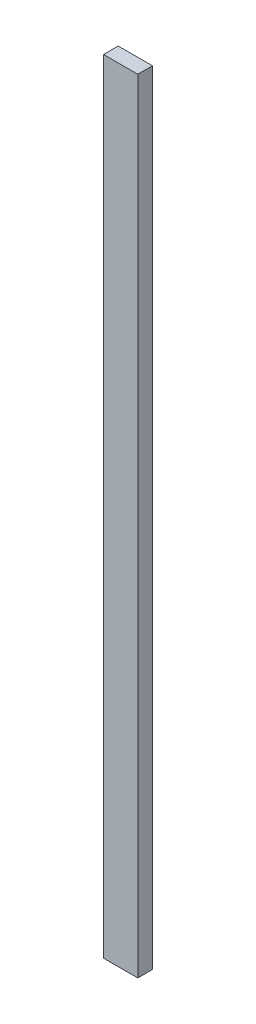
ISO-10303-21;
HEADER;
FILE_DESCRIPTION(('STEP AP214'),'2;1');
FILE_NAME('part.step','',(''),(''),'','','');
FILE_SCHEMA(('AUTOMOTIVE_DESIGN { 1 0 10303 214 1 1 1 1 }'));
ENDSEC;
DATA;
#1=APPLICATION_CONTEXT('core data for automotive mechanical design processes');
#2=APPLICATION_PROTOCOL_DEFINITION('international standard','automotive_design',2000,#1);
#3=PRODUCT_CONTEXT('',#1,'mechanical');
#4=PRODUCT('Part','Part','',(#3));
#5=PRODUCT_RELATED_PRODUCT_CATEGORY('part','',(#4));
#6=PRODUCT_DEFINITION_FORMATION('','',#4);
#7=PRODUCT_DEFINITION_CONTEXT('part definition',#1,'design');
#8=PRODUCT_DEFINITION('design','',#6,#7);
#9=PRODUCT_DEFINITION_SHAPE('','',#8);
#10=(LENGTH_UNIT() NAMED_UNIT(*) SI_UNIT(.MILLI.,.METRE.));
#11=(NAMED_UNIT(*) PLANE_ANGLE_UNIT() SI_UNIT($,.RADIAN.));
#12=(NAMED_UNIT(*) SI_UNIT($,.STERADIAN.) SOLID_ANGLE_UNIT());
#13=UNCERTAINTY_MEASURE_WITH_UNIT(LENGTH_MEASURE(1.E-05),#10,'distance_accuracy_value','');
#14=(GEOMETRIC_REPRESENTATION_CONTEXT(3) GLOBAL_UNCERTAINTY_ASSIGNED_CONTEXT((#13)) GLOBAL_UNIT_ASSIGNED_CONTEXT((#10,
#11,#12)) REPRESENTATION_CONTEXT('',''));
#15=CARTESIAN_POINT('',(0.,0.,0.));
#16=DIRECTION('',(0.,0.,1.));
#17=DIRECTION('',(1.,0.,0.));
#18=AXIS2_PLACEMENT_3D('',#15,#16,#17);
#19=CARTESIAN_POINT('',(44.45,2032.,19.05));
#20=DIRECTION('',(-1.,0.,0.));
#21=DIRECTION('',(0.,0.,1.));
#22=AXIS2_PLACEMENT_3D('',#19,#20,#21);
#23=PLANE('',#22);
#24=DIRECTION('',(0.,0.,-1.));
#25=VECTOR('',#24,1.);
#26=CARTESIAN_POINT('',(44.45,0.,19.05));
#27=LINE('',#26,#25);
#28=CARTESIAN_POINT('',(44.45,0.,19.05));
#29=VERTEX_POINT('',#28);
#30=CARTESIAN_POINT('',(44.45,0.,-19.05));
#31=VERTEX_POINT('',#30);
#32=EDGE_CURVE('E107',#29,#31,#27,.T.);
#33=ORIENTED_EDGE('',*,*,#32,.T.);
#34=DIRECTION('',(0.,-1.,0.));
#35=VECTOR('',#34,1.);
#36=CARTESIAN_POINT('',(44.45,2032.,-19.05));
#37=LINE('',#36,#35);
#38=CARTESIAN_POINT('',(44.45,2032.,-19.05));
#39=VERTEX_POINT('',#38);
#40=EDGE_CURVE('E11',#39,#31,#37,.T.);
#41=ORIENTED_EDGE('',*,*,#40,.F.);
#42=DIRECTION('',(0.,0.,-1.));
#43=VECTOR('',#42,1.);
#44=CARTESIAN_POINT('',(44.45,2032.,19.05));
#45=LINE('',#44,#43);
#46=CARTESIAN_POINT('',(44.45,2032.,19.05));
#47=VERTEX_POINT('',#46);
#48=EDGE_CURVE('E91',#47,#39,#45,.T.);
#49=ORIENTED_EDGE('',*,*,#48,.F.);
#50=DIRECTION('',(0.,-1.,0.));
#51=VECTOR('',#50,1.);
#52=CARTESIAN_POINT('',(44.45,2032.,19.05));
#53=LINE('',#52,#51);
#54=EDGE_CURVE('E103',#47,#29,#53,.T.);
#55=ORIENTED_EDGE('',*,*,#54,.T.);
#56=EDGE_LOOP('',(#33,#41,#49,#55));
#57=FACE_BOUND('',#56,.T.);
#58=ADVANCED_FACE('F39',(#57),#23,.F.);
#59=CARTESIAN_POINT('',(-44.45,2032.,-19.05));
#60=DIRECTION('',(0.,0.,1.));
#61=DIRECTION('',(1.,0.,0.));
#62=AXIS2_PLACEMENT_3D('',#59,#60,#61);
#63=PLANE('',#62);
#64=DIRECTION('',(-1.,0.,0.));
#65=VECTOR('',#64,1.);
#66=CARTESIAN_POINT('',(-44.45,0.,-19.05));
#67=LINE('',#66,#65);
#68=CARTESIAN_POINT('',(-44.45,0.,-19.05));
#69=VERTEX_POINT('',#68);
#70=EDGE_CURVE('E96',#31,#69,#67,.T.);
#71=ORIENTED_EDGE('',*,*,#70,.T.);
#72=DIRECTION('',(0.,-1.,0.));
#73=VECTOR('',#72,1.);
#74=CARTESIAN_POINT('',(-44.45,2032.,-19.05));
#75=LINE('',#74,#73);
#76=CARTESIAN_POINT('',(-44.45,2032.,-19.05));
#77=VERTEX_POINT('',#76);
#78=EDGE_CURVE('E48',#77,#69,#75,.T.);
#79=ORIENTED_EDGE('',*,*,#78,.F.);
#80=DIRECTION('',(-1.,0.,0.));
#81=VECTOR('',#80,1.);
#82=CARTESIAN_POINT('',(-44.45,2032.,-19.05));
#83=LINE('',#82,#81);
#84=EDGE_CURVE('E86',#39,#77,#83,.T.);
#85=ORIENTED_EDGE('',*,*,#84,.F.);
#86=ORIENTED_EDGE('',*,*,#40,.T.);
#87=EDGE_LOOP('',(#71,#79,#85,#86));
#88=FACE_BOUND('',#87,.T.);
#89=ADVANCED_FACE('F95',(#88),#63,.F.);
#90=CARTESIAN_POINT('',(-44.45,2032.,19.05));
#91=DIRECTION('',(1.,0.,0.));
#92=DIRECTION('',(0.,0.,-1.));
#93=AXIS2_PLACEMENT_3D('',#90,#91,#92);
#94=PLANE('',#93);
#95=DIRECTION('',(0.,0.,1.));
#96=VECTOR('',#95,1.);
#97=CARTESIAN_POINT('',(-44.45,0.,19.05));
#98=LINE('',#97,#96);
#99=CARTESIAN_POINT('',(-44.45,0.,19.05));
#100=VERTEX_POINT('',#99);
#101=EDGE_CURVE('E73',#69,#100,#98,.T.);
#102=ORIENTED_EDGE('',*,*,#101,.T.);
#103=DIRECTION('',(0.,-1.,0.));
#104=VECTOR('',#103,1.);
#105=CARTESIAN_POINT('',(-44.45,2032.,19.05));
#106=LINE('',#105,#104);
#107=CARTESIAN_POINT('',(-44.45,2032.,19.05));
#108=VERTEX_POINT('',#107);
#109=EDGE_CURVE('E98',#108,#100,#106,.T.);
#110=ORIENTED_EDGE('',*,*,#109,.F.);
#111=DIRECTION('',(0.,0.,1.));
#112=VECTOR('',#111,1.);
#113=CARTESIAN_POINT('',(-44.45,2032.,19.05));
#114=LINE('',#113,#112);
#115=EDGE_CURVE('E89',#77,#108,#114,.T.);
#116=ORIENTED_EDGE('',*,*,#115,.F.);
#117=ORIENTED_EDGE('',*,*,#78,.T.);
#118=EDGE_LOOP('',(#102,#110,#116,#117));
#119=FACE_BOUND('',#118,.T.);
#120=ADVANCED_FACE('F99',(#119),#94,.F.);
#121=CARTESIAN_POINT('',(-44.45,2032.,19.05));
#122=DIRECTION('',(0.,0.,-1.));
#123=DIRECTION('',(-1.,0.,0.));
#124=AXIS2_PLACEMENT_3D('',#121,#122,#123);
#125=PLANE('',#124);
#126=DIRECTION('',(1.,0.,0.));
#127=VECTOR('',#126,1.);
#128=CARTESIAN_POINT('',(-44.45,0.,19.05));
#129=LINE('',#128,#127);
#130=EDGE_CURVE('E79',#100,#29,#129,.T.);
#131=ORIENTED_EDGE('',*,*,#130,.T.);
#132=ORIENTED_EDGE('',*,*,#54,.F.);
#133=DIRECTION('',(1.,0.,0.));
#134=VECTOR('',#133,1.);
#135=CARTESIAN_POINT('',(-44.45,2032.,19.05));
#136=LINE('',#135,#134);
#137=EDGE_CURVE('E56',#108,#47,#136,.T.);
#138=ORIENTED_EDGE('',*,*,#137,.F.);
#139=ORIENTED_EDGE('',*,*,#109,.T.);
#140=EDGE_LOOP('',(#131,#132,#138,#139));
#141=FACE_BOUND('',#140,.T.);
#142=ADVANCED_FACE('F120',(#141),#125,.F.);
#143=CARTESIAN_POINT('',(0.,2032.,0.));
#144=DIRECTION('',(0.,-1.,0.));
#145=DIRECTION('',(0.,0.,-1.));
#146=AXIS2_PLACEMENT_3D('',#143,#144,#145);
#147=PLANE('',#146);
#148=ORIENTED_EDGE('',*,*,#48,.T.);
#149=ORIENTED_EDGE('',*,*,#84,.T.);
#150=ORIENTED_EDGE('',*,*,#115,.T.);
#151=ORIENTED_EDGE('',*,*,#137,.T.);
#152=EDGE_LOOP('',(#148,#149,#150,#151));
#153=FACE_BOUND('',#152,.T.);
#154=ADVANCED_FACE('F87',(#153),#147,.F.);
#155=CARTESIAN_POINT('',(0.,0.,0.));
#156=DIRECTION('',(0.,-1.,0.));
#157=DIRECTION('',(0.,0.,-1.));
#158=AXIS2_PLACEMENT_3D('',#155,#156,#157);
#159=PLANE('',#158);
#160=ORIENTED_EDGE('',*,*,#32,.F.);
#161=ORIENTED_EDGE('',*,*,#130,.F.);
#162=ORIENTED_EDGE('',*,*,#101,.F.);
#163=ORIENTED_EDGE('',*,*,#70,.F.);
#164=EDGE_LOOP('',(#160,#161,#162,#163));
#165=FACE_BOUND('',#164,.T.);
#166=ADVANCED_FACE('F123',(#165),#159,.T.);
#167=CLOSED_SHELL('',(#58,#89,#120,#142,#154,#166));
#168=MANIFOLD_SOLID_BREP('B2',#167);
#169=ADVANCED_BREP_SHAPE_REPRESENTATION('',(#18,#168),#14);
#170=SHAPE_DEFINITION_REPRESENTATION(#9,#169);
ENDSEC;
END-ISO-10303-21;
